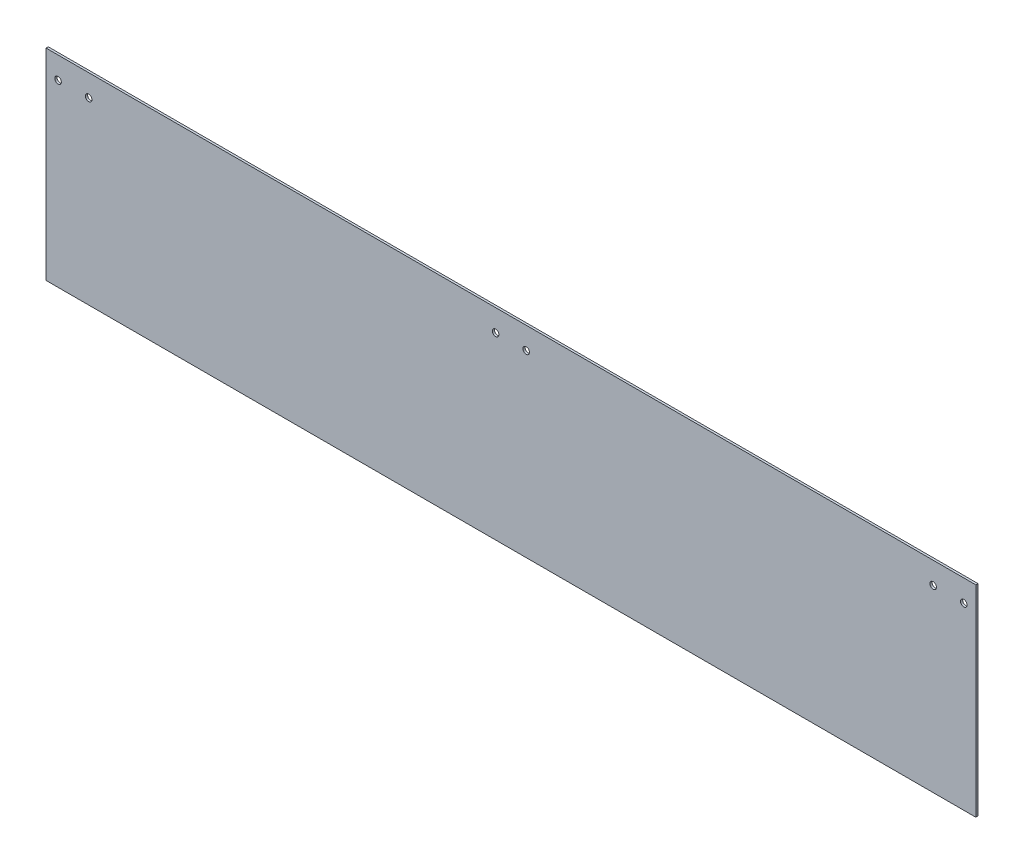
ISO-10303-21;
HEADER;
FILE_DESCRIPTION(('STEP AP214'),'2;1');
FILE_NAME('part.step','',(''),(''),'','','');
FILE_SCHEMA(('AUTOMOTIVE_DESIGN { 1 0 10303 214 1 1 1 1 }'));
ENDSEC;
DATA;
#1=APPLICATION_CONTEXT('core data for automotive mechanical design processes');
#2=APPLICATION_PROTOCOL_DEFINITION('international standard','automotive_design',2000,#1);
#3=PRODUCT_CONTEXT('',#1,'mechanical');
#4=PRODUCT('Part','Part','',(#3));
#5=PRODUCT_RELATED_PRODUCT_CATEGORY('part','',(#4));
#6=PRODUCT_DEFINITION_FORMATION('','',#4);
#7=PRODUCT_DEFINITION_CONTEXT('part definition',#1,'design');
#8=PRODUCT_DEFINITION('design','',#6,#7);
#9=PRODUCT_DEFINITION_SHAPE('','',#8);
#10=(LENGTH_UNIT() NAMED_UNIT(*) SI_UNIT(.MILLI.,.METRE.));
#11=(NAMED_UNIT(*) PLANE_ANGLE_UNIT() SI_UNIT($,.RADIAN.));
#12=(NAMED_UNIT(*) SI_UNIT($,.STERADIAN.) SOLID_ANGLE_UNIT());
#13=UNCERTAINTY_MEASURE_WITH_UNIT(LENGTH_MEASURE(1.E-05),#10,'distance_accuracy_value','');
#14=(GEOMETRIC_REPRESENTATION_CONTEXT(3) GLOBAL_UNCERTAINTY_ASSIGNED_CONTEXT((#13)) GLOBAL_UNIT_ASSIGNED_CONTEXT((#10,
#11,#12)) REPRESENTATION_CONTEXT('',''));
#15=CARTESIAN_POINT('',(0.,0.,0.));
#16=DIRECTION('',(0.,0.,1.));
#17=DIRECTION('',(1.,0.,0.));
#18=AXIS2_PLACEMENT_3D('',#15,#16,#17);
#19=CARTESIAN_POINT('',(212.5,46.,1.));
#20=DIRECTION('',(-1.,0.,0.));
#21=DIRECTION('',(0.,0.,1.));
#22=AXIS2_PLACEMENT_3D('',#19,#20,#21);
#23=PLANE('',#22);
#24=DIRECTION('',(0.,1.,0.));
#25=VECTOR('',#24,1.);
#26=CARTESIAN_POINT('',(212.5,46.,0.));
#27=LINE('',#26,#25);
#28=CARTESIAN_POINT('',(212.5,-46.,0.));
#29=VERTEX_POINT('',#28);
#30=CARTESIAN_POINT('',(212.5,46.,0.));
#31=VERTEX_POINT('',#30);
#32=EDGE_CURVE('E100',#29,#31,#27,.T.);
#33=ORIENTED_EDGE('',*,*,#32,.T.);
#34=DIRECTION('',(0.,0.,-1.));
#35=VECTOR('',#34,1.);
#36=CARTESIAN_POINT('',(212.5,46.,1.));
#37=LINE('',#36,#35);
#38=CARTESIAN_POINT('',(212.5,46.,1.));
#39=VERTEX_POINT('',#38);
#40=EDGE_CURVE('E11',#39,#31,#37,.T.);
#41=ORIENTED_EDGE('',*,*,#40,.F.);
#42=DIRECTION('',(0.,1.,0.));
#43=VECTOR('',#42,1.);
#44=CARTESIAN_POINT('',(212.5,46.,1.));
#45=LINE('',#44,#43);
#46=CARTESIAN_POINT('',(212.5,-46.,1.));
#47=VERTEX_POINT('',#46);
#48=EDGE_CURVE('E88',#47,#39,#45,.T.);
#49=ORIENTED_EDGE('',*,*,#48,.F.);
#50=DIRECTION('',(0.,0.,-1.));
#51=VECTOR('',#50,1.);
#52=CARTESIAN_POINT('',(212.5,-46.,1.));
#53=LINE('',#52,#51);
#54=EDGE_CURVE('E96',#47,#29,#53,.T.);
#55=ORIENTED_EDGE('',*,*,#54,.T.);
#56=EDGE_LOOP('',(#33,#41,#49,#55));
#57=FACE_BOUND('',#56,.T.);
#58=ADVANCED_FACE('F37',(#57),#23,.F.);
#59=CARTESIAN_POINT('',(-212.5,46.,1.));
#60=DIRECTION('',(0.,-1.,0.));
#61=DIRECTION('',(0.,0.,-1.));
#62=AXIS2_PLACEMENT_3D('',#59,#60,#61);
#63=PLANE('',#62);
#64=DIRECTION('',(-1.,0.,0.));
#65=VECTOR('',#64,1.);
#66=CARTESIAN_POINT('',(-212.5,46.,0.));
#67=LINE('',#66,#65);
#68=CARTESIAN_POINT('',(-212.5,46.,0.));
#69=VERTEX_POINT('',#68);
#70=EDGE_CURVE('E92',#31,#69,#67,.T.);
#71=ORIENTED_EDGE('',*,*,#70,.T.);
#72=DIRECTION('',(0.,0.,-1.));
#73=VECTOR('',#72,1.);
#74=CARTESIAN_POINT('',(-212.5,46.,1.));
#75=LINE('',#74,#73);
#76=CARTESIAN_POINT('',(-212.5,46.,1.));
#77=VERTEX_POINT('',#76);
#78=EDGE_CURVE('E45',#77,#69,#75,.T.);
#79=ORIENTED_EDGE('',*,*,#78,.F.);
#80=DIRECTION('',(-1.,0.,0.));
#81=VECTOR('',#80,1.);
#82=CARTESIAN_POINT('',(-212.5,46.,1.));
#83=LINE('',#82,#81);
#84=EDGE_CURVE('E83',#39,#77,#83,.T.);
#85=ORIENTED_EDGE('',*,*,#84,.F.);
#86=ORIENTED_EDGE('',*,*,#40,.T.);
#87=EDGE_LOOP('',(#71,#79,#85,#86));
#88=FACE_BOUND('',#87,.T.);
#89=ADVANCED_FACE('F91',(#88),#63,.F.);
#90=CARTESIAN_POINT('',(-212.5,46.,1.));
#91=DIRECTION('',(1.,0.,0.));
#92=DIRECTION('',(0.,0.,-1.));
#93=AXIS2_PLACEMENT_3D('',#90,#91,#92);
#94=PLANE('',#93);
#95=DIRECTION('',(0.,-1.,0.));
#96=VECTOR('',#95,1.);
#97=CARTESIAN_POINT('',(-212.5,46.,0.));
#98=LINE('',#97,#96);
#99=CARTESIAN_POINT('',(-212.5,-46.,0.));
#100=VERTEX_POINT('',#99);
#101=EDGE_CURVE('E70',#69,#100,#98,.T.);
#102=ORIENTED_EDGE('',*,*,#101,.T.);
#103=DIRECTION('',(0.,0.,-1.));
#104=VECTOR('',#103,1.);
#105=CARTESIAN_POINT('',(-212.5,-46.,1.));
#106=LINE('',#105,#104);
#107=CARTESIAN_POINT('',(-212.5,-46.,1.));
#108=VERTEX_POINT('',#107);
#109=EDGE_CURVE('E93',#108,#100,#106,.T.);
#110=ORIENTED_EDGE('',*,*,#109,.F.);
#111=DIRECTION('',(0.,-1.,0.));
#112=VECTOR('',#111,1.);
#113=CARTESIAN_POINT('',(-212.5,46.,1.));
#114=LINE('',#113,#112);
#115=EDGE_CURVE('E86',#77,#108,#114,.T.);
#116=ORIENTED_EDGE('',*,*,#115,.F.);
#117=ORIENTED_EDGE('',*,*,#78,.T.);
#118=EDGE_LOOP('',(#102,#110,#116,#117));
#119=FACE_BOUND('',#118,.T.);
#120=ADVANCED_FACE('F94',(#119),#94,.F.);
#121=CARTESIAN_POINT('',(-212.5,-46.,1.));
#122=DIRECTION('',(0.,1.,0.));
#123=DIRECTION('',(0.,0.,1.));
#124=AXIS2_PLACEMENT_3D('',#121,#122,#123);
#125=PLANE('',#124);
#126=DIRECTION('',(1.,0.,0.));
#127=VECTOR('',#126,1.);
#128=CARTESIAN_POINT('',(-212.5,-46.,0.));
#129=LINE('',#128,#127);
#130=EDGE_CURVE('E76',#100,#29,#129,.T.);
#131=ORIENTED_EDGE('',*,*,#130,.T.);
#132=ORIENTED_EDGE('',*,*,#54,.F.);
#133=DIRECTION('',(1.,0.,0.));
#134=VECTOR('',#133,1.);
#135=CARTESIAN_POINT('',(-212.5,-46.,1.));
#136=LINE('',#135,#134);
#137=EDGE_CURVE('E53',#108,#47,#136,.T.);
#138=ORIENTED_EDGE('',*,*,#137,.F.);
#139=ORIENTED_EDGE('',*,*,#109,.T.);
#140=EDGE_LOOP('',(#131,#132,#138,#139));
#141=FACE_BOUND('',#140,.T.);
#142=ADVANCED_FACE('F108',(#141),#125,.F.);
#143=CARTESIAN_POINT('',(0.,0.,1.));
#144=DIRECTION('',(0.,0.,1.));
#145=DIRECTION('',(1.,0.,0.));
#146=AXIS2_PLACEMENT_3D('',#143,#144,#145);
#147=PLANE('',#146);
#148=CARTESIAN_POINT('',(-207.,36.,1.));
#149=DIRECTION('',(0.,0.,1.));
#150=DIRECTION('',(1.,0.,0.));
#151=AXIS2_PLACEMENT_3D('',#148,#149,#150);
#152=CIRCLE('',#151,1.5);
#153=CARTESIAN_POINT('',(-205.5,36.,1.));
#154=VERTEX_POINT('',#153);
#155=EDGE_CURVE('E139',#154,#154,#152,.T.);
#156=ORIENTED_EDGE('',*,*,#155,.F.);
#157=EDGE_LOOP('',(#156));
#158=FACE_BOUND('',#157,.T.);
#159=CARTESIAN_POINT('',(-193.,36.,1.));
#160=DIRECTION('',(0.,0.,1.));
#161=DIRECTION('',(1.,0.,0.));
#162=AXIS2_PLACEMENT_3D('',#159,#160,#161);
#163=CIRCLE('',#162,1.5);
#164=CARTESIAN_POINT('',(-191.5,36.,1.));
#165=VERTEX_POINT('',#164);
#166=EDGE_CURVE('E133',#165,#165,#163,.T.);
#167=ORIENTED_EDGE('',*,*,#166,.F.);
#168=EDGE_LOOP('',(#167));
#169=FACE_BOUND('',#168,.T.);
#170=CARTESIAN_POINT('',(193.,35.9999999999979,1.));
#171=DIRECTION('',(0.,0.,1.));
#172=DIRECTION('',(-1.,0.,0.));
#173=AXIS2_PLACEMENT_3D('',#170,#171,#172);
#174=CIRCLE('',#173,1.5);
#175=CARTESIAN_POINT('',(191.5,35.9999999999979,1.));
#176=VERTEX_POINT('',#175);
#177=EDGE_CURVE('E127',#176,#176,#174,.T.);
#178=ORIENTED_EDGE('',*,*,#177,.F.);
#179=EDGE_LOOP('',(#178));
#180=FACE_BOUND('',#179,.T.);
#181=CARTESIAN_POINT('',(207.,35.9999999999977,1.));
#182=DIRECTION('',(0.,0.,1.));
#183=DIRECTION('',(-1.,0.,0.));
#184=AXIS2_PLACEMENT_3D('',#181,#182,#183);
#185=CIRCLE('',#184,1.5);
#186=CARTESIAN_POINT('',(205.5,35.9999999999977,1.));
#187=VERTEX_POINT('',#186);
#188=EDGE_CURVE('E120',#187,#187,#185,.T.);
#189=ORIENTED_EDGE('',*,*,#188,.F.);
#190=EDGE_LOOP('',(#189));
#191=FACE_BOUND('',#190,.T.);
#192=CARTESIAN_POINT('',(7.,35.9999999999999,1.));
#193=DIRECTION('',(0.,0.,1.));
#194=DIRECTION('',(-1.,0.,0.));
#195=AXIS2_PLACEMENT_3D('',#192,#193,#194);
#196=CIRCLE('',#195,1.5);
#197=CARTESIAN_POINT('',(5.5,35.9999999999999,1.));
#198=VERTEX_POINT('',#197);
#199=EDGE_CURVE('E144',#198,#198,#196,.T.);
#200=ORIENTED_EDGE('',*,*,#199,.F.);
#201=EDGE_LOOP('',(#200));
#202=FACE_BOUND('',#201,.T.);
#203=CARTESIAN_POINT('',(-7.,36.,1.));
#204=DIRECTION('',(0.,0.,1.));
#205=DIRECTION('',(1.,0.,0.));
#206=AXIS2_PLACEMENT_3D('',#203,#204,#205);
#207=CIRCLE('',#206,1.5);
#208=CARTESIAN_POINT('',(-5.5,36.,1.));
#209=VERTEX_POINT('',#208);
#210=EDGE_CURVE('E114',#209,#209,#207,.T.);
#211=ORIENTED_EDGE('',*,*,#210,.F.);
#212=EDGE_LOOP('',(#211));
#213=FACE_BOUND('',#212,.T.);
#214=ORIENTED_EDGE('',*,*,#48,.T.);
#215=ORIENTED_EDGE('',*,*,#84,.T.);
#216=ORIENTED_EDGE('',*,*,#115,.T.);
#217=ORIENTED_EDGE('',*,*,#137,.T.);
#218=EDGE_LOOP('',(#214,#215,#216,#217));
#219=FACE_BOUND('',#218,.T.);
#220=ADVANCED_FACE('F84',(#158,#169,#180,#191,#202,#213,#219),#147,.T.);
#221=CARTESIAN_POINT('',(0.,0.,0.));
#222=DIRECTION('',(0.,0.,1.));
#223=DIRECTION('',(1.,0.,0.));
#224=AXIS2_PLACEMENT_3D('',#221,#222,#223);
#225=PLANE('',#224);
#226=CARTESIAN_POINT('',(-207.,36.,0.));
#227=DIRECTION('',(0.,0.,1.));
#228=DIRECTION('',(1.,0.,0.));
#229=AXIS2_PLACEMENT_3D('',#226,#227,#228);
#230=CIRCLE('',#229,1.5);
#231=CARTESIAN_POINT('',(-205.5,36.,0.));
#232=VERTEX_POINT('',#231);
#233=EDGE_CURVE('E117',#232,#232,#230,.T.);
#234=ORIENTED_EDGE('',*,*,#233,.T.);
#235=EDGE_LOOP('',(#234));
#236=FACE_BOUND('',#235,.T.);
#237=CARTESIAN_POINT('',(-193.,36.,0.));
#238=DIRECTION('',(0.,0.,1.));
#239=DIRECTION('',(1.,0.,0.));
#240=AXIS2_PLACEMENT_3D('',#237,#238,#239);
#241=CIRCLE('',#240,1.5);
#242=CARTESIAN_POINT('',(-191.5,36.,0.));
#243=VERTEX_POINT('',#242);
#244=EDGE_CURVE('E136',#243,#243,#241,.T.);
#245=ORIENTED_EDGE('',*,*,#244,.T.);
#246=EDGE_LOOP('',(#245));
#247=FACE_BOUND('',#246,.T.);
#248=CARTESIAN_POINT('',(193.,35.9999999999979,0.));
#249=DIRECTION('',(0.,0.,1.));
#250=DIRECTION('',(-1.,0.,0.));
#251=AXIS2_PLACEMENT_3D('',#248,#249,#250);
#252=CIRCLE('',#251,1.5);
#253=CARTESIAN_POINT('',(191.5,35.9999999999979,0.));
#254=VERTEX_POINT('',#253);
#255=EDGE_CURVE('E130',#254,#254,#252,.T.);
#256=ORIENTED_EDGE('',*,*,#255,.T.);
#257=EDGE_LOOP('',(#256));
#258=FACE_BOUND('',#257,.T.);
#259=CARTESIAN_POINT('',(207.,35.9999999999977,0.));
#260=DIRECTION('',(0.,0.,1.));
#261=DIRECTION('',(-1.,0.,0.));
#262=AXIS2_PLACEMENT_3D('',#259,#260,#261);
#263=CIRCLE('',#262,1.5);
#264=CARTESIAN_POINT('',(205.5,35.9999999999977,0.));
#265=VERTEX_POINT('',#264);
#266=EDGE_CURVE('E123',#265,#265,#263,.T.);
#267=ORIENTED_EDGE('',*,*,#266,.T.);
#268=EDGE_LOOP('',(#267));
#269=FACE_BOUND('',#268,.T.);
#270=CARTESIAN_POINT('',(7.,35.9999999999999,0.));
#271=DIRECTION('',(0.,0.,1.));
#272=DIRECTION('',(-1.,0.,0.));
#273=AXIS2_PLACEMENT_3D('',#270,#271,#272);
#274=CIRCLE('',#273,1.5);
#275=CARTESIAN_POINT('',(5.5,35.9999999999999,0.));
#276=VERTEX_POINT('',#275);
#277=EDGE_CURVE('E124',#276,#276,#274,.T.);
#278=ORIENTED_EDGE('',*,*,#277,.T.);
#279=EDGE_LOOP('',(#278));
#280=FACE_BOUND('',#279,.T.);
#281=CARTESIAN_POINT('',(-7.,36.,0.));
#282=DIRECTION('',(0.,0.,1.));
#283=DIRECTION('',(1.,0.,0.));
#284=AXIS2_PLACEMENT_3D('',#281,#282,#283);
#285=CIRCLE('',#284,1.5);
#286=CARTESIAN_POINT('',(-5.5,36.,0.));
#287=VERTEX_POINT('',#286);
#288=EDGE_CURVE('E103',#287,#287,#285,.T.);
#289=ORIENTED_EDGE('',*,*,#288,.T.);
#290=EDGE_LOOP('',(#289));
#291=FACE_BOUND('',#290,.T.);
#292=ORIENTED_EDGE('',*,*,#32,.F.);
#293=ORIENTED_EDGE('',*,*,#130,.F.);
#294=ORIENTED_EDGE('',*,*,#101,.F.);
#295=ORIENTED_EDGE('',*,*,#70,.F.);
#296=EDGE_LOOP('',(#292,#293,#294,#295));
#297=FACE_BOUND('',#296,.T.);
#298=ADVANCED_FACE('F111',(#236,#247,#258,#269,#280,#291,#297),#225,.F.);
#299=CARTESIAN_POINT('',(-7.,36.,0.));
#300=DIRECTION('',(0.,0.,1.));
#301=DIRECTION('',(1.,0.,0.));
#302=AXIS2_PLACEMENT_3D('',#299,#300,#301);
#303=CYLINDRICAL_SURFACE('',#302,1.5);
#304=ORIENTED_EDGE('',*,*,#288,.F.);
#305=EDGE_LOOP('',(#304));
#306=FACE_BOUND('',#305,.T.);
#307=ORIENTED_EDGE('',*,*,#210,.T.);
#308=EDGE_LOOP('',(#307));
#309=FACE_BOUND('',#308,.T.);
#310=ADVANCED_FACE('F156',(#306,#309),#303,.F.);
#311=CARTESIAN_POINT('',(7.,35.9999999999999,0.));
#312=DIRECTION('',(0.,0.,1.));
#313=DIRECTION('',(1.,0.,0.));
#314=AXIS2_PLACEMENT_3D('',#311,#312,#313);
#315=CYLINDRICAL_SURFACE('',#314,1.5);
#316=ORIENTED_EDGE('',*,*,#277,.F.);
#317=EDGE_LOOP('',(#316));
#318=FACE_BOUND('',#317,.T.);
#319=ORIENTED_EDGE('',*,*,#199,.T.);
#320=EDGE_LOOP('',(#319));
#321=FACE_BOUND('',#320,.T.);
#322=ADVANCED_FACE('F152',(#318,#321),#315,.F.);
#323=CARTESIAN_POINT('',(207.,35.9999999999977,0.));
#324=DIRECTION('',(0.,0.,1.));
#325=DIRECTION('',(1.,0.,0.));
#326=AXIS2_PLACEMENT_3D('',#323,#324,#325);
#327=CYLINDRICAL_SURFACE('',#326,1.5);
#328=ORIENTED_EDGE('',*,*,#266,.F.);
#329=EDGE_LOOP('',(#328));
#330=FACE_BOUND('',#329,.T.);
#331=ORIENTED_EDGE('',*,*,#188,.T.);
#332=EDGE_LOOP('',(#331));
#333=FACE_BOUND('',#332,.T.);
#334=ADVANCED_FACE('F155',(#330,#333),#327,.F.);
#335=CARTESIAN_POINT('',(193.,35.9999999999979,0.));
#336=DIRECTION('',(0.,0.,1.));
#337=DIRECTION('',(1.,0.,0.));
#338=AXIS2_PLACEMENT_3D('',#335,#336,#337);
#339=CYLINDRICAL_SURFACE('',#338,1.5);
#340=ORIENTED_EDGE('',*,*,#255,.F.);
#341=EDGE_LOOP('',(#340));
#342=FACE_BOUND('',#341,.T.);
#343=ORIENTED_EDGE('',*,*,#177,.T.);
#344=EDGE_LOOP('',(#343));
#345=FACE_BOUND('',#344,.T.);
#346=ADVANCED_FACE('F217',(#342,#345),#339,.F.);
#347=CARTESIAN_POINT('',(-193.,36.,0.));
#348=DIRECTION('',(0.,0.,1.));
#349=DIRECTION('',(1.,0.,0.));
#350=AXIS2_PLACEMENT_3D('',#347,#348,#349);
#351=CYLINDRICAL_SURFACE('',#350,1.5);
#352=ORIENTED_EDGE('',*,*,#244,.F.);
#353=EDGE_LOOP('',(#352));
#354=FACE_BOUND('',#353,.T.);
#355=ORIENTED_EDGE('',*,*,#166,.T.);
#356=EDGE_LOOP('',(#355));
#357=FACE_BOUND('',#356,.T.);
#358=ADVANCED_FACE('F226',(#354,#357),#351,.F.);
#359=CARTESIAN_POINT('',(-207.,36.,0.));
#360=DIRECTION('',(0.,0.,1.));
#361=DIRECTION('',(1.,0.,0.));
#362=AXIS2_PLACEMENT_3D('',#359,#360,#361);
#363=CYLINDRICAL_SURFACE('',#362,1.5);
#364=ORIENTED_EDGE('',*,*,#233,.F.);
#365=EDGE_LOOP('',(#364));
#366=FACE_BOUND('',#365,.T.);
#367=ORIENTED_EDGE('',*,*,#155,.T.);
#368=EDGE_LOOP('',(#367));
#369=FACE_BOUND('',#368,.T.);
#370=ADVANCED_FACE('F236',(#366,#369),#363,.F.);
#371=CLOSED_SHELL('',(#58,#89,#120,#142,#220,#298,#310,#322,#334,#346,#358,#370));
#372=MANIFOLD_SOLID_BREP('B2',#371);
#373=ADVANCED_BREP_SHAPE_REPRESENTATION('',(#18,#372),#14);
#374=SHAPE_DEFINITION_REPRESENTATION(#9,#373);
ENDSEC;
END-ISO-10303-21;
